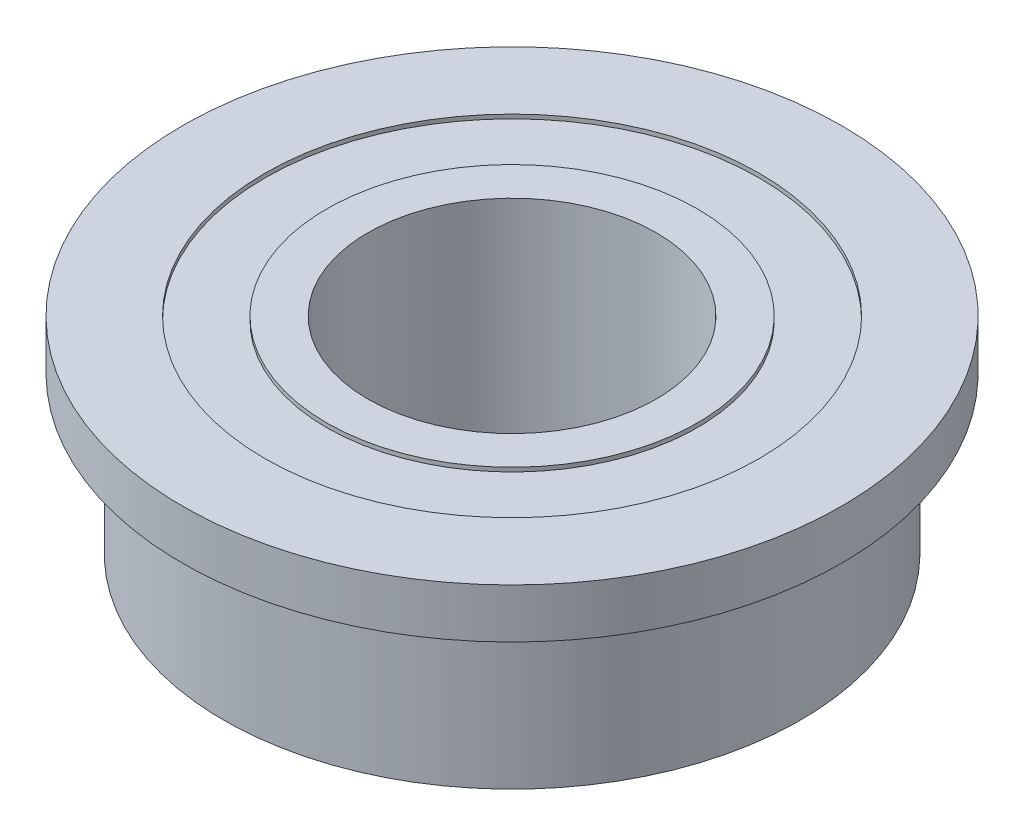
ISO-10303-21;
HEADER;
FILE_DESCRIPTION(('STEP AP214'),'2;1');
FILE_NAME('part.step','',(''),(''),'','','');
FILE_SCHEMA(('AUTOMOTIVE_DESIGN { 1 0 10303 214 1 1 1 1 }'));
ENDSEC;
DATA;
#1=APPLICATION_CONTEXT('core data for automotive mechanical design processes');
#2=APPLICATION_PROTOCOL_DEFINITION('international standard','automotive_design',2000,#1);
#3=PRODUCT_CONTEXT('',#1,'mechanical');
#4=PRODUCT('Part','Part','',(#3));
#5=PRODUCT_RELATED_PRODUCT_CATEGORY('part','',(#4));
#6=PRODUCT_DEFINITION_FORMATION('','',#4);
#7=PRODUCT_DEFINITION_CONTEXT('part definition',#1,'design');
#8=PRODUCT_DEFINITION('design','',#6,#7);
#9=PRODUCT_DEFINITION_SHAPE('','',#8);
#10=(LENGTH_UNIT() NAMED_UNIT(*) SI_UNIT(.MILLI.,.METRE.));
#11=(NAMED_UNIT(*) PLANE_ANGLE_UNIT() SI_UNIT($,.RADIAN.));
#12=(NAMED_UNIT(*) SI_UNIT($,.STERADIAN.) SOLID_ANGLE_UNIT());
#13=UNCERTAINTY_MEASURE_WITH_UNIT(LENGTH_MEASURE(1.E-05),#10,'distance_accuracy_value','');
#14=(GEOMETRIC_REPRESENTATION_CONTEXT(3) GLOBAL_UNCERTAINTY_ASSIGNED_CONTEXT((#13)) GLOBAL_UNIT_ASSIGNED_CONTEXT((#10,
#11,#12)) REPRESENTATION_CONTEXT('',''));
#15=CARTESIAN_POINT('',(0.,0.,0.));
#16=DIRECTION('',(0.,0.,1.));
#17=DIRECTION('',(1.,0.,0.));
#18=AXIS2_PLACEMENT_3D('',#15,#16,#17);
#19=CARTESIAN_POINT('',(3.5,5.,0.));
#20=DIRECTION('',(0.,1.,0.));
#21=DIRECTION('',(0.,0.,1.));
#22=AXIS2_PLACEMENT_3D('',#19,#20,#21);
#23=PLANE('',#22);
#24=CARTESIAN_POINT('',(0.,5.,0.));
#25=DIRECTION('',(0.,-1.,0.));
#26=DIRECTION('',(0.,0.,-1.));
#27=AXIS2_PLACEMENT_3D('',#24,#25,#26);
#28=CIRCLE('',#27,3.5);
#29=CARTESIAN_POINT('',(0.,5.,-3.5));
#30=VERTEX_POINT('',#29);
#31=EDGE_CURVE('E52',#30,#30,#28,.T.);
#32=ORIENTED_EDGE('',*,*,#31,.T.);
#33=EDGE_LOOP('',(#32));
#34=FACE_BOUND('',#33,.T.);
#35=CARTESIAN_POINT('',(0.,5.,0.));
#36=DIRECTION('',(0.,1.,0.));
#37=DIRECTION('',(0.,0.,1.));
#38=AXIS2_PLACEMENT_3D('',#35,#36,#37);
#39=CIRCLE('',#38,4.5);
#40=CARTESIAN_POINT('',(0.,5.,4.5));
#41=VERTEX_POINT('',#40);
#42=EDGE_CURVE('E66',#41,#41,#39,.T.);
#43=ORIENTED_EDGE('',*,*,#42,.T.);
#44=EDGE_LOOP('',(#43));
#45=FACE_BOUND('',#44,.T.);
#46=ADVANCED_FACE('F44',(#34,#45),#23,.T.);
#47=CARTESIAN_POINT('',(7.,0.,0.));
#48=DIRECTION('',(0.,-1.,0.));
#49=DIRECTION('',(0.,0.,-1.));
#50=AXIS2_PLACEMENT_3D('',#47,#48,#49);
#51=PLANE('',#50);
#52=CARTESIAN_POINT('',(0.,0.,0.));
#53=DIRECTION('',(0.,-1.,0.));
#54=DIRECTION('',(0.,0.,-1.));
#55=AXIS2_PLACEMENT_3D('',#52,#53,#54);
#56=CIRCLE('',#55,3.5);
#57=CARTESIAN_POINT('',(0.,0.,-3.5));
#58=VERTEX_POINT('',#57);
#59=EDGE_CURVE('E10',#58,#58,#56,.T.);
#60=ORIENTED_EDGE('',*,*,#59,.F.);
#61=EDGE_LOOP('',(#60));
#62=FACE_BOUND('',#61,.T.);
#63=CARTESIAN_POINT('',(0.,0.,0.));
#64=DIRECTION('',(0.,-1.,0.));
#65=DIRECTION('',(0.,0.,-1.));
#66=AXIS2_PLACEMENT_3D('',#63,#64,#65);
#67=CIRCLE('',#66,4.5);
#68=CARTESIAN_POINT('',(0.,0.,-4.5));
#69=VERTEX_POINT('',#68);
#70=EDGE_CURVE('E65',#69,#69,#67,.T.);
#71=ORIENTED_EDGE('',*,*,#70,.T.);
#72=EDGE_LOOP('',(#71));
#73=FACE_BOUND('',#72,.T.);
#74=ADVANCED_FACE('F113',(#62,#73),#51,.T.);
#75=CARTESIAN_POINT('',(0.,0.,0.));
#76=DIRECTION('',(0.,-1.,0.));
#77=DIRECTION('',(0.,0.,-1.));
#78=AXIS2_PLACEMENT_3D('',#75,#76,#77);
#79=CIRCLE('',#78,6.);
#80=CARTESIAN_POINT('',(0.,0.,-6.));
#81=VERTEX_POINT('',#80);
#82=EDGE_CURVE('E62',#81,#81,#79,.T.);
#83=ORIENTED_EDGE('',*,*,#82,.F.);
#84=EDGE_LOOP('',(#83));
#85=FACE_BOUND('',#84,.T.);
#86=CARTESIAN_POINT('',(0.,0.,0.));
#87=DIRECTION('',(0.,-1.,0.));
#88=DIRECTION('',(0.,0.,-1.));
#89=AXIS2_PLACEMENT_3D('',#86,#87,#88);
#90=CIRCLE('',#89,7.);
#91=CARTESIAN_POINT('',(0.,0.,-7.));
#92=VERTEX_POINT('',#91);
#93=EDGE_CURVE('E69',#92,#92,#90,.T.);
#94=ORIENTED_EDGE('',*,*,#93,.T.);
#95=EDGE_LOOP('',(#94));
#96=FACE_BOUND('',#95,.T.);
#97=ADVANCED_FACE('F50',(#85,#96),#51,.T.);
#98=CARTESIAN_POINT('',(0.,0.,0.));
#99=DIRECTION('',(0.,-1.,0.));
#100=DIRECTION('',(0.,0.,-1.));
#101=AXIS2_PLACEMENT_3D('',#98,#99,#100);
#102=CYLINDRICAL_SURFACE('',#101,3.5);
#103=ORIENTED_EDGE('',*,*,#59,.T.);
#104=EDGE_LOOP('',(#103));
#105=FACE_BOUND('',#104,.T.);
#106=ORIENTED_EDGE('',*,*,#31,.F.);
#107=EDGE_LOOP('',(#106));
#108=FACE_BOUND('',#107,.T.);
#109=ADVANCED_FACE('F103',(#105,#108),#102,.F.);
#110=CARTESIAN_POINT('',(0.,5.,0.));
#111=DIRECTION('',(0.,1.,0.));
#112=DIRECTION('',(0.,0.,1.));
#113=AXIS2_PLACEMENT_3D('',#110,#111,#112);
#114=CIRCLE('',#113,6.);
#115=CARTESIAN_POINT('',(0.,5.,6.));
#116=VERTEX_POINT('',#115);
#117=EDGE_CURVE('E47',#116,#116,#114,.T.);
#118=ORIENTED_EDGE('',*,*,#117,.F.);
#119=EDGE_LOOP('',(#118));
#120=FACE_BOUND('',#119,.T.);
#121=CARTESIAN_POINT('',(0.,5.,0.));
#122=DIRECTION('',(0.,-1.,0.));
#123=DIRECTION('',(0.,0.,-1.));
#124=AXIS2_PLACEMENT_3D('',#121,#122,#123);
#125=CIRCLE('',#124,8.);
#126=CARTESIAN_POINT('',(0.,5.,-8.));
#127=VERTEX_POINT('',#126);
#128=EDGE_CURVE('E59',#127,#127,#125,.T.);
#129=ORIENTED_EDGE('',*,*,#128,.F.);
#130=EDGE_LOOP('',(#129));
#131=FACE_BOUND('',#130,.T.);
#132=ADVANCED_FACE('F101',(#120,#131),#23,.T.);
#133=CARTESIAN_POINT('',(0.,0.,0.));
#134=DIRECTION('',(0.,-1.,0.));
#135=DIRECTION('',(0.,0.,-1.));
#136=AXIS2_PLACEMENT_3D('',#133,#134,#135);
#137=CYLINDRICAL_SURFACE('',#136,8.);
#138=ORIENTED_EDGE('',*,*,#128,.T.);
#139=EDGE_LOOP('',(#138));
#140=FACE_BOUND('',#139,.T.);
#141=CARTESIAN_POINT('',(0.,3.8,0.));
#142=DIRECTION('',(0.,-1.,0.));
#143=DIRECTION('',(0.,0.,-1.));
#144=AXIS2_PLACEMENT_3D('',#141,#142,#143);
#145=CIRCLE('',#144,8.);
#146=CARTESIAN_POINT('',(0.,3.8,-8.));
#147=VERTEX_POINT('',#146);
#148=EDGE_CURVE('E91',#147,#147,#145,.T.);
#149=ORIENTED_EDGE('',*,*,#148,.F.);
#150=EDGE_LOOP('',(#149));
#151=FACE_BOUND('',#150,.T.);
#152=ADVANCED_FACE('F98',(#140,#151),#137,.T.);
#153=CARTESIAN_POINT('',(8.,3.8,0.));
#154=DIRECTION('',(0.,-1.,0.));
#155=DIRECTION('',(0.,0.,-1.));
#156=AXIS2_PLACEMENT_3D('',#153,#154,#155);
#157=PLANE('',#156);
#158=ORIENTED_EDGE('',*,*,#148,.T.);
#159=EDGE_LOOP('',(#158));
#160=FACE_BOUND('',#159,.T.);
#161=CARTESIAN_POINT('',(0.,3.8,0.));
#162=DIRECTION('',(0.,-1.,0.));
#163=DIRECTION('',(0.,0.,-1.));
#164=AXIS2_PLACEMENT_3D('',#161,#162,#163);
#165=CIRCLE('',#164,7.);
#166=CARTESIAN_POINT('',(0.,3.8,-7.));
#167=VERTEX_POINT('',#166);
#168=EDGE_CURVE('E89',#167,#167,#165,.T.);
#169=ORIENTED_EDGE('',*,*,#168,.F.);
#170=EDGE_LOOP('',(#169));
#171=FACE_BOUND('',#170,.T.);
#172=ADVANCED_FACE('F112',(#160,#171),#157,.T.);
#173=CARTESIAN_POINT('',(0.,0.,0.));
#174=DIRECTION('',(0.,-1.,0.));
#175=DIRECTION('',(0.,0.,-1.));
#176=AXIS2_PLACEMENT_3D('',#173,#174,#175);
#177=CYLINDRICAL_SURFACE('',#176,7.);
#178=ORIENTED_EDGE('',*,*,#168,.T.);
#179=EDGE_LOOP('',(#178));
#180=FACE_BOUND('',#179,.T.);
#181=ORIENTED_EDGE('',*,*,#93,.F.);
#182=EDGE_LOOP('',(#181));
#183=FACE_BOUND('',#182,.T.);
#184=ADVANCED_FACE('F148',(#180,#183),#177,.T.);
#185=CARTESIAN_POINT('',(0.,0.1,0.));
#186=DIRECTION('',(0.,-1.,0.));
#187=DIRECTION('',(0.,0.,-1.));
#188=AXIS2_PLACEMENT_3D('',#185,#186,#187);
#189=CYLINDRICAL_SURFACE('',#188,6.);
#190=ORIENTED_EDGE('',*,*,#82,.T.);
#191=EDGE_LOOP('',(#190));
#192=FACE_BOUND('',#191,.T.);
#193=CARTESIAN_POINT('',(0.,0.1,0.));
#194=DIRECTION('',(0.,-1.,0.));
#195=DIRECTION('',(0.,0.,-1.));
#196=AXIS2_PLACEMENT_3D('',#193,#194,#195);
#197=CIRCLE('',#196,6.);
#198=CARTESIAN_POINT('',(0.,0.1,-6.));
#199=VERTEX_POINT('',#198);
#200=EDGE_CURVE('E67',#199,#199,#197,.T.);
#201=ORIENTED_EDGE('',*,*,#200,.F.);
#202=EDGE_LOOP('',(#201));
#203=FACE_BOUND('',#202,.T.);
#204=ADVANCED_FACE('F143',(#192,#203),#189,.F.);
#205=CARTESIAN_POINT('',(0.,0.1,0.));
#206=DIRECTION('',(0.,-1.,0.));
#207=DIRECTION('',(0.,0.,-1.));
#208=AXIS2_PLACEMENT_3D('',#205,#206,#207);
#209=PLANE('',#208);
#210=CARTESIAN_POINT('',(0.,0.1,0.));
#211=DIRECTION('',(0.,-1.,0.));
#212=DIRECTION('',(0.,0.,-1.));
#213=AXIS2_PLACEMENT_3D('',#210,#211,#212);
#214=CIRCLE('',#213,4.5);
#215=CARTESIAN_POINT('',(0.,0.1,-4.5));
#216=VERTEX_POINT('',#215);
#217=EDGE_CURVE('E73',#216,#216,#214,.T.);
#218=ORIENTED_EDGE('',*,*,#217,.F.);
#219=EDGE_LOOP('',(#218));
#220=FACE_BOUND('',#219,.T.);
#221=ORIENTED_EDGE('',*,*,#200,.T.);
#222=EDGE_LOOP('',(#221));
#223=FACE_BOUND('',#222,.T.);
#224=ADVANCED_FACE('F132',(#220,#223),#209,.T.);
#225=CARTESIAN_POINT('',(0.,0.1,0.));
#226=DIRECTION('',(0.,-1.,0.));
#227=DIRECTION('',(0.,0.,-1.));
#228=AXIS2_PLACEMENT_3D('',#225,#226,#227);
#229=CYLINDRICAL_SURFACE('',#228,4.5);
#230=ORIENTED_EDGE('',*,*,#70,.F.);
#231=EDGE_LOOP('',(#230));
#232=FACE_BOUND('',#231,.T.);
#233=ORIENTED_EDGE('',*,*,#217,.T.);
#234=EDGE_LOOP('',(#233));
#235=FACE_BOUND('',#234,.T.);
#236=ADVANCED_FACE('F135',(#232,#235),#229,.T.);
#237=CARTESIAN_POINT('',(0.,4.9,0.));
#238=DIRECTION('',(0.,1.,0.));
#239=DIRECTION('',(0.,0.,1.));
#240=AXIS2_PLACEMENT_3D('',#237,#238,#239);
#241=CYLINDRICAL_SURFACE('',#240,6.);
#242=ORIENTED_EDGE('',*,*,#117,.T.);
#243=EDGE_LOOP('',(#242));
#244=FACE_BOUND('',#243,.T.);
#245=CARTESIAN_POINT('',(0.,4.9,0.));
#246=DIRECTION('',(0.,1.,0.));
#247=DIRECTION('',(0.,0.,1.));
#248=AXIS2_PLACEMENT_3D('',#245,#246,#247);
#249=CIRCLE('',#248,6.);
#250=CARTESIAN_POINT('',(0.,4.9,6.));
#251=VERTEX_POINT('',#250);
#252=EDGE_CURVE('E72',#251,#251,#249,.T.);
#253=ORIENTED_EDGE('',*,*,#252,.F.);
#254=EDGE_LOOP('',(#253));
#255=FACE_BOUND('',#254,.T.);
#256=ADVANCED_FACE('F134',(#244,#255),#241,.F.);
#257=CARTESIAN_POINT('',(0.,4.9,0.));
#258=DIRECTION('',(0.,1.,0.));
#259=DIRECTION('',(0.,0.,1.));
#260=AXIS2_PLACEMENT_3D('',#257,#258,#259);
#261=PLANE('',#260);
#262=CARTESIAN_POINT('',(0.,4.9,0.));
#263=DIRECTION('',(0.,1.,0.));
#264=DIRECTION('',(0.,0.,1.));
#265=AXIS2_PLACEMENT_3D('',#262,#263,#264);
#266=CIRCLE('',#265,4.5);
#267=CARTESIAN_POINT('',(0.,4.9,4.5));
#268=VERTEX_POINT('',#267);
#269=EDGE_CURVE('E80',#268,#268,#266,.T.);
#270=ORIENTED_EDGE('',*,*,#269,.F.);
#271=EDGE_LOOP('',(#270));
#272=FACE_BOUND('',#271,.T.);
#273=ORIENTED_EDGE('',*,*,#252,.T.);
#274=EDGE_LOOP('',(#273));
#275=FACE_BOUND('',#274,.T.);
#276=ADVANCED_FACE('F206',(#272,#275),#261,.T.);
#277=CARTESIAN_POINT('',(0.,4.9,0.));
#278=DIRECTION('',(0.,1.,0.));
#279=DIRECTION('',(0.,0.,1.));
#280=AXIS2_PLACEMENT_3D('',#277,#278,#279);
#281=CYLINDRICAL_SURFACE('',#280,4.5);
#282=ORIENTED_EDGE('',*,*,#42,.F.);
#283=EDGE_LOOP('',(#282));
#284=FACE_BOUND('',#283,.T.);
#285=ORIENTED_EDGE('',*,*,#269,.T.);
#286=EDGE_LOOP('',(#285));
#287=FACE_BOUND('',#286,.T.);
#288=ADVANCED_FACE('F220',(#284,#287),#281,.T.);
#289=CLOSED_SHELL('',(#46,#74,#97,#109,#132,#152,#172,#184,#204,#224,#236,#256,#276,#288));
#290=MANIFOLD_SOLID_BREP('B2',#289);
#291=ADVANCED_BREP_SHAPE_REPRESENTATION('',(#18,#290),#14);
#292=SHAPE_DEFINITION_REPRESENTATION(#9,#291);
ENDSEC;
END-ISO-10303-21;
